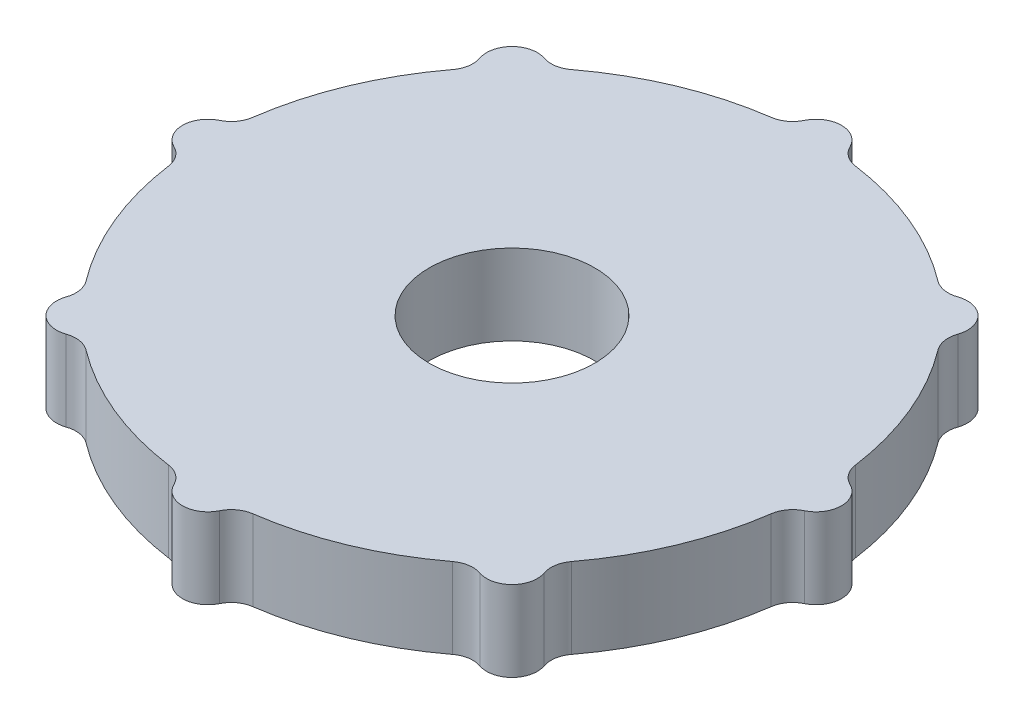
ISO-10303-21;
HEADER;
FILE_DESCRIPTION(('STEP AP214'),'2;1');
FILE_NAME('part.step','',(''),(''),'','','');
FILE_SCHEMA(('AUTOMOTIVE_DESIGN { 1 0 10303 214 1 1 1 1 }'));
ENDSEC;
DATA;
#1=APPLICATION_CONTEXT('core data for automotive mechanical design processes');
#2=APPLICATION_PROTOCOL_DEFINITION('international standard','automotive_design',2000,#1);
#3=PRODUCT_CONTEXT('',#1,'mechanical');
#4=PRODUCT('Part','Part','',(#3));
#5=PRODUCT_RELATED_PRODUCT_CATEGORY('part','',(#4));
#6=PRODUCT_DEFINITION_FORMATION('','',#4);
#7=PRODUCT_DEFINITION_CONTEXT('part definition',#1,'design');
#8=PRODUCT_DEFINITION('design','',#6,#7);
#9=PRODUCT_DEFINITION_SHAPE('','',#8);
#10=(LENGTH_UNIT() NAMED_UNIT(*) SI_UNIT(.MILLI.,.METRE.));
#11=(NAMED_UNIT(*) PLANE_ANGLE_UNIT() SI_UNIT($,.RADIAN.));
#12=(NAMED_UNIT(*) SI_UNIT($,.STERADIAN.) SOLID_ANGLE_UNIT());
#13=UNCERTAINTY_MEASURE_WITH_UNIT(LENGTH_MEASURE(1.E-05),#10,'distance_accuracy_value','');
#14=(GEOMETRIC_REPRESENTATION_CONTEXT(3) GLOBAL_UNCERTAINTY_ASSIGNED_CONTEXT((#13)) GLOBAL_UNIT_ASSIGNED_CONTEXT((#10,
#11,#12)) REPRESENTATION_CONTEXT('',''));
#15=CARTESIAN_POINT('',(0.,0.,0.));
#16=DIRECTION('',(0.,0.,1.));
#17=DIRECTION('',(1.,0.,0.));
#18=AXIS2_PLACEMENT_3D('',#15,#16,#17);
#19=CARTESIAN_POINT('',(0.,3.175,0.));
#20=DIRECTION('',(0.,-1.,0.));
#21=DIRECTION('',(0.,0.,-1.));
#22=AXIS2_PLACEMENT_3D('',#19,#20,#21);
#23=CYLINDRICAL_SURFACE('',#22,12.);
#24=DIRECTION('',(0.,-1.,0.));
#25=VECTOR('',#24,1.);
#26=CARTESIAN_POINT('',(-11.8846153846154,3.175,-1.66009552730061));
#27=LINE('',#26,#25);
#28=CARTESIAN_POINT('',(-11.8846153846154,3.175,-1.66009552730061));
#29=VERTEX_POINT('',#28);
#30=CARTESIAN_POINT('',(-11.8846153846154,0.,-1.66009552730061));
#31=VERTEX_POINT('',#30);
#32=EDGE_CURVE('E324',#29,#31,#27,.T.);
#33=ORIENTED_EDGE('',*,*,#32,.F.);
#34=CARTESIAN_POINT('',(0.,3.175,0.));
#35=DIRECTION('',(0.,1.,0.));
#36=DIRECTION('',(0.,0.,1.));
#37=AXIS2_PLACEMENT_3D('',#34,#35,#36);
#38=CIRCLE('',#37,12.);
#39=CARTESIAN_POINT('',(-9.57755693502715,3.175,-7.22982732548388));
#40=VERTEX_POINT('',#39);
#41=EDGE_CURVE('E528',#40,#29,#38,.T.);
#42=ORIENTED_EDGE('',*,*,#41,.F.);
#43=DIRECTION('',(0.,-1.,0.));
#44=VECTOR('',#43,1.);
#45=CARTESIAN_POINT('',(-9.57755693502715,3.175,-7.22982732548388));
#46=LINE('',#45,#44);
#47=CARTESIAN_POINT('',(-9.57755693502715,0.,-7.22982732548388));
#48=VERTEX_POINT('',#47);
#49=EDGE_CURVE('E357',#40,#48,#46,.T.);
#50=ORIENTED_EDGE('',*,*,#49,.T.);
#51=CARTESIAN_POINT('',(0.,0.,0.));
#52=DIRECTION('',(0.,1.,0.));
#53=DIRECTION('',(0.,0.,1.));
#54=AXIS2_PLACEMENT_3D('',#51,#52,#53);
#55=CIRCLE('',#54,12.);
#56=EDGE_CURVE('E474',#48,#31,#55,.T.);
#57=ORIENTED_EDGE('',*,*,#56,.T.);
#58=EDGE_LOOP('',(#33,#42,#50,#57));
#59=FACE_BOUND('',#58,.T.);
#60=ADVANCED_FACE('F41',(#59),#23,.T.);
#61=DIRECTION('',(0.,-1.,0.));
#62=VECTOR('',#61,1.);
#63=CARTESIAN_POINT('',(-7.22982732548377,3.175,-9.57755693502723));
#64=LINE('',#63,#62);
#65=CARTESIAN_POINT('',(-7.22982732548377,3.175,-9.57755693502723));
#66=VERTEX_POINT('',#65);
#67=CARTESIAN_POINT('',(-7.22982732548377,0.,-9.57755693502723));
#68=VERTEX_POINT('',#67);
#69=EDGE_CURVE('E348',#66,#68,#64,.T.);
#70=ORIENTED_EDGE('',*,*,#69,.F.);
#71=CARTESIAN_POINT('',(-1.66009552730056,3.175,-11.8846153846154));
#72=VERTEX_POINT('',#71);
#73=EDGE_CURVE('E524',#72,#66,#38,.T.);
#74=ORIENTED_EDGE('',*,*,#73,.F.);
#75=DIRECTION('',(0.,-1.,0.));
#76=VECTOR('',#75,1.);
#77=CARTESIAN_POINT('',(-1.66009552730056,3.175,-11.8846153846154));
#78=LINE('',#77,#76);
#79=CARTESIAN_POINT('',(-1.66009552730056,0.,-11.8846153846154));
#80=VERTEX_POINT('',#79);
#81=EDGE_CURVE('E383',#72,#80,#78,.T.);
#82=ORIENTED_EDGE('',*,*,#81,.T.);
#83=EDGE_CURVE('E477',#80,#68,#55,.T.);
#84=ORIENTED_EDGE('',*,*,#83,.T.);
#85=EDGE_LOOP('',(#70,#74,#82,#84));
#86=FACE_BOUND('',#85,.T.);
#87=ADVANCED_FACE('F553',(#86),#23,.T.);
#88=DIRECTION('',(0.,-1.,0.));
#89=VECTOR('',#88,1.);
#90=CARTESIAN_POINT('',(1.66009552730056,3.175,-11.8846153846154));
#91=LINE('',#90,#89);
#92=CARTESIAN_POINT('',(1.66009552730056,3.175,-11.8846153846154));
#93=VERTEX_POINT('',#92);
#94=CARTESIAN_POINT('',(1.66009552730056,0.,-11.8846153846154));
#95=VERTEX_POINT('',#94);
#96=EDGE_CURVE('E372',#93,#95,#91,.T.);
#97=ORIENTED_EDGE('',*,*,#96,.F.);
#98=CARTESIAN_POINT('',(7.22982732548391,3.175,-9.57755693502712));
#99=VERTEX_POINT('',#98);
#100=EDGE_CURVE('E525',#99,#93,#38,.T.);
#101=ORIENTED_EDGE('',*,*,#100,.F.);
#102=DIRECTION('',(0.,-1.,0.));
#103=VECTOR('',#102,1.);
#104=CARTESIAN_POINT('',(7.22982732548391,3.175,-9.57755693502712));
#105=LINE('',#104,#103);
#106=CARTESIAN_POINT('',(7.22982732548391,0.,-9.57755693502713));
#107=VERTEX_POINT('',#106);
#108=EDGE_CURVE('E408',#99,#107,#105,.T.);
#109=ORIENTED_EDGE('',*,*,#108,.T.);
#110=EDGE_CURVE('E484',#107,#95,#55,.T.);
#111=ORIENTED_EDGE('',*,*,#110,.T.);
#112=EDGE_LOOP('',(#97,#101,#109,#111));
#113=FACE_BOUND('',#112,.T.);
#114=ADVANCED_FACE('F556',(#113),#23,.T.);
#115=DIRECTION('',(0.,-1.,0.));
#116=VECTOR('',#115,1.);
#117=CARTESIAN_POINT('',(9.57755693502726,3.175,-7.22982732548374));
#118=LINE('',#117,#116);
#119=CARTESIAN_POINT('',(9.57755693502726,3.175,-7.22982732548374));
#120=VERTEX_POINT('',#119);
#121=CARTESIAN_POINT('',(9.57755693502726,0.,-7.22982732548374));
#122=VERTEX_POINT('',#121);
#123=EDGE_CURVE('E396',#120,#122,#118,.T.);
#124=ORIENTED_EDGE('',*,*,#123,.F.);
#125=CARTESIAN_POINT('',(11.8846153846154,3.175,-1.66009552730043));
#126=VERTEX_POINT('',#125);
#127=EDGE_CURVE('E515',#126,#120,#38,.T.);
#128=ORIENTED_EDGE('',*,*,#127,.F.);
#129=DIRECTION('',(0.,-1.,0.));
#130=VECTOR('',#129,1.);
#131=CARTESIAN_POINT('',(11.8846153846154,3.175,-1.66009552730043));
#132=LINE('',#131,#130);
#133=CARTESIAN_POINT('',(11.8846153846154,0.,-1.66009552730043));
#134=VERTEX_POINT('',#133);
#135=EDGE_CURVE('E292',#126,#134,#132,.T.);
#136=ORIENTED_EDGE('',*,*,#135,.T.);
#137=EDGE_CURVE('E469',#134,#122,#55,.T.);
#138=ORIENTED_EDGE('',*,*,#137,.T.);
#139=EDGE_LOOP('',(#124,#128,#136,#138));
#140=FACE_BOUND('',#139,.T.);
#141=ADVANCED_FACE('F500',(#140),#23,.T.);
#142=DIRECTION('',(0.,-1.,0.));
#143=VECTOR('',#142,1.);
#144=CARTESIAN_POINT('',(11.8846153846154,3.175,1.66009552730069));
#145=LINE('',#144,#143);
#146=CARTESIAN_POINT('',(11.8846153846154,3.175,1.66009552730069));
#147=VERTEX_POINT('',#146);
#148=CARTESIAN_POINT('',(11.8846153846154,0.,1.66009552730069));
#149=VERTEX_POINT('',#148);
#150=EDGE_CURVE('E284',#147,#149,#145,.T.);
#151=ORIENTED_EDGE('',*,*,#150,.F.);
#152=CARTESIAN_POINT('',(9.5775569350271,3.175,7.22982732548394));
#153=VERTEX_POINT('',#152);
#154=EDGE_CURVE('E274',#153,#147,#38,.T.);
#155=ORIENTED_EDGE('',*,*,#154,.F.);
#156=DIRECTION('',(0.,-1.,0.));
#157=VECTOR('',#156,1.);
#158=CARTESIAN_POINT('',(9.5775569350271,3.175,7.22982732548394));
#159=LINE('',#158,#157);
#160=CARTESIAN_POINT('',(9.5775569350271,0.,7.22982732548394));
#161=VERTEX_POINT('',#160);
#162=EDGE_CURVE('E315',#153,#161,#159,.T.);
#163=ORIENTED_EDGE('',*,*,#162,.T.);
#164=EDGE_CURVE('E462',#161,#149,#55,.T.);
#165=ORIENTED_EDGE('',*,*,#164,.T.);
#166=EDGE_LOOP('',(#151,#155,#163,#165));
#167=FACE_BOUND('',#166,.T.);
#168=ADVANCED_FACE('F605',(#167),#23,.T.);
#169=DIRECTION('',(0.,-1.,0.));
#170=VECTOR('',#169,1.);
#171=CARTESIAN_POINT('',(7.2298273254837,3.175,9.57755693502728));
#172=LINE('',#171,#170);
#173=CARTESIAN_POINT('',(7.2298273254837,3.175,9.57755693502728));
#174=VERTEX_POINT('',#173);
#175=CARTESIAN_POINT('',(7.2298273254837,0.,9.57755693502728));
#176=VERTEX_POINT('',#175);
#177=EDGE_CURVE('E301',#174,#176,#172,.T.);
#178=ORIENTED_EDGE('',*,*,#177,.F.);
#179=CARTESIAN_POINT('',(1.66009552730056,3.175,11.8846153846154));
#180=VERTEX_POINT('',#179);
#181=EDGE_CURVE('E49',#180,#174,#38,.T.);
#182=ORIENTED_EDGE('',*,*,#181,.F.);
#183=DIRECTION('',(0.,-1.,0.));
#184=VECTOR('',#183,1.);
#185=CARTESIAN_POINT('',(1.66009552730056,3.175,11.8846153846154));
#186=LINE('',#185,#184);
#187=CARTESIAN_POINT('',(1.66009552730056,0.,11.8846153846154));
#188=VERTEX_POINT('',#187);
#189=EDGE_CURVE('E455',#180,#188,#186,.T.);
#190=ORIENTED_EDGE('',*,*,#189,.T.);
#191=EDGE_CURVE('E463',#188,#176,#55,.T.);
#192=ORIENTED_EDGE('',*,*,#191,.T.);
#193=EDGE_LOOP('',(#178,#182,#190,#192));
#194=FACE_BOUND('',#193,.T.);
#195=ADVANCED_FACE('F554',(#194),#23,.T.);
#196=CARTESIAN_POINT('',(-11.8846153846154,3.175,1.66009552730051));
#197=VERTEX_POINT('',#196);
#198=CARTESIAN_POINT('',(-9.57755693502721,3.175,7.2298273254838));
#199=VERTEX_POINT('',#198);
#200=EDGE_CURVE('E529',#197,#199,#38,.T.);
#201=ORIENTED_EDGE('',*,*,#200,.F.);
#202=DIRECTION('',(0.,-1.,0.));
#203=VECTOR('',#202,1.);
#204=CARTESIAN_POINT('',(-11.8846153846154,3.175,1.66009552730051));
#205=LINE('',#204,#203);
#206=CARTESIAN_POINT('',(-11.8846153846154,0.,1.66009552730051));
#207=VERTEX_POINT('',#206);
#208=EDGE_CURVE('E333',#197,#207,#205,.T.);
#209=ORIENTED_EDGE('',*,*,#208,.T.);
#210=CARTESIAN_POINT('',(-9.57755693502721,0.,7.2298273254838));
#211=VERTEX_POINT('',#210);
#212=EDGE_CURVE('E467',#207,#211,#55,.T.);
#213=ORIENTED_EDGE('',*,*,#212,.T.);
#214=DIRECTION('',(0.,-1.,0.));
#215=VECTOR('',#214,1.);
#216=CARTESIAN_POINT('',(-9.57755693502721,3.175,7.2298273254838));
#217=LINE('',#216,#215);
#218=EDGE_CURVE('E420',#199,#211,#217,.T.);
#219=ORIENTED_EDGE('',*,*,#218,.F.);
#220=EDGE_LOOP('',(#201,#209,#213,#219));
#221=FACE_BOUND('',#220,.T.);
#222=ADVANCED_FACE('F546',(#221),#23,.T.);
#223=CARTESIAN_POINT('',(-7.22982732548384,3.175,9.57755693502718));
#224=VERTEX_POINT('',#223);
#225=CARTESIAN_POINT('',(-1.66009552730056,3.175,11.8846153846154));
#226=VERTEX_POINT('',#225);
#227=EDGE_CURVE('E458',#224,#226,#38,.T.);
#228=ORIENTED_EDGE('',*,*,#227,.F.);
#229=DIRECTION('',(0.,-1.,0.));
#230=VECTOR('',#229,1.);
#231=CARTESIAN_POINT('',(-7.22982732548384,3.175,9.57755693502718));
#232=LINE('',#231,#230);
#233=CARTESIAN_POINT('',(-7.22982732548384,0.,9.57755693502718));
#234=VERTEX_POINT('',#233);
#235=EDGE_CURVE('E430',#224,#234,#232,.T.);
#236=ORIENTED_EDGE('',*,*,#235,.T.);
#237=CARTESIAN_POINT('',(-1.66009552730056,0.,11.8846153846154));
#238=VERTEX_POINT('',#237);
#239=EDGE_CURVE('E459',#234,#238,#55,.T.);
#240=ORIENTED_EDGE('',*,*,#239,.T.);
#241=DIRECTION('',(0.,-1.,0.));
#242=VECTOR('',#241,1.);
#243=CARTESIAN_POINT('',(-1.66009552730056,3.175,11.8846153846154));
#244=LINE('',#243,#242);
#245=EDGE_CURVE('E444',#226,#238,#244,.T.);
#246=ORIENTED_EDGE('',*,*,#245,.F.);
#247=EDGE_LOOP('',(#228,#236,#240,#246));
#248=FACE_BOUND('',#247,.T.);
#249=ADVANCED_FACE('F43',(#248),#23,.T.);
#250=CARTESIAN_POINT('',(0.,3.175,0.));
#251=DIRECTION('',(0.,-1.,0.));
#252=DIRECTION('',(0.,0.,-1.));
#253=AXIS2_PLACEMENT_3D('',#250,#251,#252);
#254=CYLINDRICAL_SURFACE('',#253,3.2639);
#255=CARTESIAN_POINT('',(0.,3.175,0.));
#256=DIRECTION('',(0.,1.,0.));
#257=DIRECTION('',(0.,0.,1.));
#258=AXIS2_PLACEMENT_3D('',#255,#256,#257);
#259=CIRCLE('',#258,3.2639);
#260=CARTESIAN_POINT('',(0.,3.175,3.2639));
#261=VERTEX_POINT('',#260);
#262=EDGE_CURVE('E11',#261,#261,#259,.T.);
#263=ORIENTED_EDGE('',*,*,#262,.T.);
#264=EDGE_LOOP('',(#263));
#265=FACE_BOUND('',#264,.T.);
#266=CARTESIAN_POINT('',(0.,0.,0.));
#267=DIRECTION('',(0.,1.,0.));
#268=DIRECTION('',(0.,0.,1.));
#269=AXIS2_PLACEMENT_3D('',#266,#267,#268);
#270=CIRCLE('',#269,3.2639);
#271=CARTESIAN_POINT('',(0.,0.,3.2639));
#272=VERTEX_POINT('',#271);
#273=EDGE_CURVE('E44',#272,#272,#270,.T.);
#274=ORIENTED_EDGE('',*,*,#273,.F.);
#275=EDGE_LOOP('',(#274));
#276=FACE_BOUND('',#275,.T.);
#277=ADVANCED_FACE('F544',(#265,#276),#254,.F.);
#278=CARTESIAN_POINT('',(0.,3.175,0.));
#279=DIRECTION('',(0.,1.,0.));
#280=DIRECTION('',(0.,0.,1.));
#281=AXIS2_PLACEMENT_3D('',#278,#279,#280);
#282=PLANE('',#281);
#283=ORIENTED_EDGE('',*,*,#181,.T.);
#284=CARTESIAN_POINT('',(7.83231293594069,3.175,10.3756866796129));
#285=DIRECTION('',(0.,1.,0.));
#286=DIRECTION('',(0.707106781186539,0.,0.707106781186556));
#287=AXIS2_PLACEMENT_3D('',#284,#285,#286);
#288=CIRCLE('',#287,1.00000000000001);
#289=CARTESIAN_POINT('',(8.15879715508958,3.175,9.43048402692578));
#290=VERTEX_POINT('',#289);
#291=EDGE_CURVE('E293',#290,#174,#288,.T.);
#292=ORIENTED_EDGE('',*,*,#291,.F.);
#293=CARTESIAN_POINT('',(8.48528137423847,3.175,8.48528137423867));
#294=DIRECTION('',(0.,1.,0.));
#295=DIRECTION('',(0.707106781186539,0.,0.707106781186556));
#296=AXIS2_PLACEMENT_3D('',#293,#294,#295);
#297=CIRCLE('',#296,1.);
#298=CARTESIAN_POINT('',(9.43048402692558,3.175,8.15879715508981));
#299=VERTEX_POINT('',#298);
#300=EDGE_CURVE('E299',#299,#290,#297,.F.);
#301=ORIENTED_EDGE('',*,*,#300,.F.);
#302=CARTESIAN_POINT('',(10.3756866796127,3.175,7.83231293594094));
#303=DIRECTION('',(0.,1.,0.));
#304=DIRECTION('',(0.707106781186539,0.,0.707106781186556));
#305=AXIS2_PLACEMENT_3D('',#302,#303,#304);
#306=CIRCLE('',#305,1.);
#307=EDGE_CURVE('E303',#299,#153,#306,.F.);
#308=ORIENTED_EDGE('',*,*,#307,.T.);
#309=ORIENTED_EDGE('',*,*,#154,.T.);
#310=CARTESIAN_POINT('',(12.875,3.175,1.79843682124241));
#311=DIRECTION('',(0.,1.,0.));
#312=DIRECTION('',(1.,0.,0.));
#313=AXIS2_PLACEMENT_3D('',#310,#311,#312);
#314=CIRCLE('',#313,1.00000000000001);
#315=CARTESIAN_POINT('',(12.4375,3.175,0.899218410621265));
#316=VERTEX_POINT('',#315);
#317=EDGE_CURVE('E258',#316,#147,#314,.T.);
#318=ORIENTED_EDGE('',*,*,#317,.F.);
#319=CARTESIAN_POINT('',(12.,3.175,1.25656588794378E-13));
#320=DIRECTION('',(0.,1.,0.));
#321=DIRECTION('',(1.,0.,0.));
#322=AXIS2_PLACEMENT_3D('',#319,#320,#321);
#323=CIRCLE('',#322,1.);
#324=CARTESIAN_POINT('',(12.4375,3.175,-0.899218410621004));
#325=VERTEX_POINT('',#324);
#326=EDGE_CURVE('E272',#325,#316,#323,.F.);
#327=ORIENTED_EDGE('',*,*,#326,.F.);
#328=CARTESIAN_POINT('',(12.875,3.175,-1.79843682124213));
#329=DIRECTION('',(0.,1.,0.));
#330=DIRECTION('',(1.,0.,0.));
#331=AXIS2_PLACEMENT_3D('',#328,#329,#330);
#332=CIRCLE('',#331,1.);
#333=EDGE_CURVE('E278',#325,#126,#332,.F.);
#334=ORIENTED_EDGE('',*,*,#333,.T.);
#335=ORIENTED_EDGE('',*,*,#127,.T.);
#336=CARTESIAN_POINT('',(10.3756866796129,3.175,-7.83231293594072));
#337=DIRECTION('',(0.,1.,0.));
#338=DIRECTION('',(0.707106781186554,0.,-0.707106781186541));
#339=AXIS2_PLACEMENT_3D('',#336,#337,#338);
#340=CIRCLE('',#339,1.00000000000001);
#341=CARTESIAN_POINT('',(9.43048402692575,3.175,-8.15879715508961));
#342=VERTEX_POINT('',#341);
#343=EDGE_CURVE('E388',#342,#120,#340,.T.);
#344=ORIENTED_EDGE('',*,*,#343,.F.);
#345=CARTESIAN_POINT('',(8.48528137423864,3.175,-8.4852813742385));
#346=DIRECTION('',(0.,1.,0.));
#347=DIRECTION('',(0.707106781186554,0.,-0.707106781186541));
#348=AXIS2_PLACEMENT_3D('',#345,#346,#347);
#349=CIRCLE('',#348,1.);
#350=CARTESIAN_POINT('',(8.15879715508978,3.175,-9.43048402692561));
#351=VERTEX_POINT('',#350);
#352=EDGE_CURVE('E394',#351,#342,#349,.F.);
#353=ORIENTED_EDGE('',*,*,#352,.F.);
#354=CARTESIAN_POINT('',(7.83231293594091,3.175,-10.3756866796127));
#355=DIRECTION('',(0.,1.,0.));
#356=DIRECTION('',(0.707106781186554,0.,-0.707106781186541));
#357=AXIS2_PLACEMENT_3D('',#354,#355,#356);
#358=CIRCLE('',#357,1.);
#359=EDGE_CURVE('E398',#351,#99,#358,.F.);
#360=ORIENTED_EDGE('',*,*,#359,.T.);
#361=ORIENTED_EDGE('',*,*,#100,.T.);
#362=CARTESIAN_POINT('',(1.79843682124228,3.175,-12.875));
#363=DIRECTION('',(0.,1.,0.));
#364=DIRECTION('',(0.,0.,-1.));
#365=AXIS2_PLACEMENT_3D('',#362,#363,#364);
#366=CIRCLE('',#365,1.00000000000001);
#367=CARTESIAN_POINT('',(0.899218410621135,3.175,-12.4375));
#368=VERTEX_POINT('',#367);
#369=EDGE_CURVE('E368',#368,#93,#366,.T.);
#370=ORIENTED_EDGE('',*,*,#369,.F.);
#371=CARTESIAN_POINT('',(0.,3.175,-12.));
#372=DIRECTION('',(0.,1.,0.));
#373=DIRECTION('',(0.,0.,-1.));
#374=AXIS2_PLACEMENT_3D('',#371,#372,#373);
#375=CIRCLE('',#374,1.);
#376=CARTESIAN_POINT('',(-0.899218410621135,3.175,-12.4375));
#377=VERTEX_POINT('',#376);
#378=EDGE_CURVE('E366',#377,#368,#375,.F.);
#379=ORIENTED_EDGE('',*,*,#378,.F.);
#380=CARTESIAN_POINT('',(-1.79843682124227,3.175,-12.875));
#381=DIRECTION('',(0.,1.,0.));
#382=DIRECTION('',(0.,0.,-1.));
#383=AXIS2_PLACEMENT_3D('',#380,#381,#382);
#384=CIRCLE('',#383,1.);
#385=EDGE_CURVE('E375',#377,#72,#384,.F.);
#386=ORIENTED_EDGE('',*,*,#385,.T.);
#387=ORIENTED_EDGE('',*,*,#73,.T.);
#388=CARTESIAN_POINT('',(-7.83231293594076,3.175,-10.3756866796128));
#389=DIRECTION('',(0.,1.,0.));
#390=DIRECTION('',(-0.707106781186544,0.,-0.707106781186551));
#391=AXIS2_PLACEMENT_3D('',#388,#389,#390);
#392=CIRCLE('',#391,1.00000000000001);
#393=CARTESIAN_POINT('',(-8.15879715508964,3.175,-9.43048402692572));
#394=VERTEX_POINT('',#393);
#395=EDGE_CURVE('E345',#394,#66,#392,.T.);
#396=ORIENTED_EDGE('',*,*,#395,.F.);
#397=CARTESIAN_POINT('',(-8.48528137423853,3.175,-8.48528137423861));
#398=DIRECTION('',(0.,1.,0.));
#399=DIRECTION('',(-0.707106781186544,0.,-0.707106781186551));
#400=AXIS2_PLACEMENT_3D('',#397,#398,#399);
#401=CIRCLE('',#400,1.);
#402=CARTESIAN_POINT('',(-9.43048402692564,3.175,-8.15879715508974));
#403=VERTEX_POINT('',#402);
#404=EDGE_CURVE('E344',#403,#394,#401,.F.);
#405=ORIENTED_EDGE('',*,*,#404,.F.);
#406=CARTESIAN_POINT('',(-10.3756866796128,3.175,-7.83231293594087));
#407=DIRECTION('',(0.,1.,0.));
#408=DIRECTION('',(-0.707106781186544,0.,-0.707106781186551));
#409=AXIS2_PLACEMENT_3D('',#406,#407,#408);
#410=CIRCLE('',#409,1.);
#411=EDGE_CURVE('E346',#403,#40,#410,.F.);
#412=ORIENTED_EDGE('',*,*,#411,.T.);
#413=ORIENTED_EDGE('',*,*,#41,.T.);
#414=CARTESIAN_POINT('',(-12.875,3.175,-1.79843682124232));
#415=DIRECTION('',(0.,1.,0.));
#416=DIRECTION('',(-1.,0.,0.));
#417=AXIS2_PLACEMENT_3D('',#414,#415,#416);
#418=CIRCLE('',#417,1.00000000000001);
#419=CARTESIAN_POINT('',(-12.4375,3.175,-0.899218410621178));
#420=VERTEX_POINT('',#419);
#421=EDGE_CURVE('E318',#420,#29,#418,.T.);
#422=ORIENTED_EDGE('',*,*,#421,.F.);
#423=CARTESIAN_POINT('',(-12.,3.175,0.));
#424=DIRECTION('',(0.,1.,0.));
#425=DIRECTION('',(-1.,0.,0.));
#426=AXIS2_PLACEMENT_3D('',#423,#424,#425);
#427=CIRCLE('',#426,1.);
#428=CARTESIAN_POINT('',(-12.4375,3.175,0.899218410621091));
#429=VERTEX_POINT('',#428);
#430=EDGE_CURVE('E319',#429,#420,#427,.F.);
#431=ORIENTED_EDGE('',*,*,#430,.F.);
#432=CARTESIAN_POINT('',(-12.875,3.175,1.79843682124222));
#433=DIRECTION('',(0.,1.,0.));
#434=DIRECTION('',(-1.,0.,0.));
#435=AXIS2_PLACEMENT_3D('',#432,#433,#434);
#436=CIRCLE('',#435,1.);
#437=EDGE_CURVE('E323',#429,#197,#436,.F.);
#438=ORIENTED_EDGE('',*,*,#437,.T.);
#439=ORIENTED_EDGE('',*,*,#200,.T.);
#440=CARTESIAN_POINT('',(-10.3756866796128,3.175,7.8323129359408));
#441=DIRECTION('',(0.,1.,0.));
#442=DIRECTION('',(-0.707106781186549,0.,0.707106781186546));
#443=AXIS2_PLACEMENT_3D('',#440,#441,#442);
#444=CIRCLE('',#443,1.00000000000001);
#445=CARTESIAN_POINT('',(-9.4304840269257,3.175,8.15879715508968));
#446=VERTEX_POINT('',#445);
#447=EDGE_CURVE('E415',#446,#199,#444,.T.);
#448=ORIENTED_EDGE('',*,*,#447,.F.);
#449=CARTESIAN_POINT('',(-8.48528137423859,3.175,8.48528137423856));
#450=DIRECTION('',(0.,1.,0.));
#451=DIRECTION('',(-0.707106781186549,0.,0.707106781186546));
#452=AXIS2_PLACEMENT_3D('',#449,#450,#451);
#453=CIRCLE('',#452,1.);
#454=CARTESIAN_POINT('',(-8.15879715508971,3.175,9.43048402692567));
#455=VERTEX_POINT('',#454);
#456=EDGE_CURVE('E414',#455,#446,#453,.F.);
#457=ORIENTED_EDGE('',*,*,#456,.F.);
#458=CARTESIAN_POINT('',(-7.83231293594083,3.175,10.3756866796128));
#459=DIRECTION('',(0.,1.,0.));
#460=DIRECTION('',(-0.707106781186549,0.,0.707106781186546));
#461=AXIS2_PLACEMENT_3D('',#458,#459,#460);
#462=CIRCLE('',#461,1.);
#463=EDGE_CURVE('E417',#455,#224,#462,.F.);
#464=ORIENTED_EDGE('',*,*,#463,.T.);
#465=ORIENTED_EDGE('',*,*,#227,.T.);
#466=CARTESIAN_POINT('',(-1.79843682124228,3.175,12.875));
#467=DIRECTION('',(0.,1.,0.));
#468=DIRECTION('',(0.,0.,1.));
#469=AXIS2_PLACEMENT_3D('',#466,#467,#468);
#470=CIRCLE('',#469,1.00000000000001);
#471=CARTESIAN_POINT('',(-0.899218410621135,3.175,12.4375));
#472=VERTEX_POINT('',#471);
#473=EDGE_CURVE('E432',#472,#226,#470,.T.);
#474=ORIENTED_EDGE('',*,*,#473,.F.);
#475=CARTESIAN_POINT('',(0.,3.175,12.));
#476=DIRECTION('',(0.,1.,0.));
#477=DIRECTION('',(0.,0.,1.));
#478=AXIS2_PLACEMENT_3D('',#475,#476,#477);
#479=CIRCLE('',#478,1.);
#480=CARTESIAN_POINT('',(0.899218410621135,3.175,12.4375));
#481=VERTEX_POINT('',#480);
#482=EDGE_CURVE('E440',#481,#472,#479,.F.);
#483=ORIENTED_EDGE('',*,*,#482,.F.);
#484=CARTESIAN_POINT('',(1.79843682124227,3.175,12.875));
#485=DIRECTION('',(0.,1.,0.));
#486=DIRECTION('',(0.,0.,1.));
#487=AXIS2_PLACEMENT_3D('',#484,#485,#486);
#488=CIRCLE('',#487,1.);
#489=EDGE_CURVE('E442',#481,#180,#488,.F.);
#490=ORIENTED_EDGE('',*,*,#489,.T.);
#491=EDGE_LOOP('',(#283,#292,#301,#308,#309,#318,#327,#334,#335,#344,#353,#360,#361,#370,#379,
#386,#387,#396,#405,#412,#413,#422,#431,#438,#439,#448,#457,#464,#465,#474,#483,#490));
#492=FACE_BOUND('',#491,.T.);
#493=ORIENTED_EDGE('',*,*,#262,.F.);
#494=EDGE_LOOP('',(#493));
#495=FACE_BOUND('',#494,.T.);
#496=ADVANCED_FACE('F271',(#492,#495),#282,.T.);
#497=CARTESIAN_POINT('',(0.,0.,0.));
#498=DIRECTION('',(0.,1.,0.));
#499=DIRECTION('',(0.,0.,1.));
#500=AXIS2_PLACEMENT_3D('',#497,#498,#499);
#501=PLANE('',#500);
#502=ORIENTED_EDGE('',*,*,#191,.F.);
#503=CARTESIAN_POINT('',(1.79843682124227,0.,12.875));
#504=DIRECTION('',(0.,1.,0.));
#505=DIRECTION('',(0.,0.,1.));
#506=AXIS2_PLACEMENT_3D('',#503,#504,#505);
#507=CIRCLE('',#506,1.);
#508=CARTESIAN_POINT('',(0.899218410621135,0.,12.4375));
#509=VERTEX_POINT('',#508);
#510=EDGE_CURVE('E437',#509,#188,#507,.F.);
#511=ORIENTED_EDGE('',*,*,#510,.F.);
#512=CARTESIAN_POINT('',(0.,0.,12.));
#513=DIRECTION('',(0.,1.,0.));
#514=DIRECTION('',(0.,0.,1.));
#515=AXIS2_PLACEMENT_3D('',#512,#513,#514);
#516=CIRCLE('',#515,1.);
#517=CARTESIAN_POINT('',(-0.899218410621135,0.,12.4375));
#518=VERTEX_POINT('',#517);
#519=EDGE_CURVE('E448',#509,#518,#516,.F.);
#520=ORIENTED_EDGE('',*,*,#519,.T.);
#521=CARTESIAN_POINT('',(-1.79843682124228,0.,12.875));
#522=DIRECTION('',(0.,1.,0.));
#523=DIRECTION('',(0.,0.,1.));
#524=AXIS2_PLACEMENT_3D('',#521,#522,#523);
#525=CIRCLE('',#524,1.00000000000001);
#526=EDGE_CURVE('E433',#518,#238,#525,.T.);
#527=ORIENTED_EDGE('',*,*,#526,.T.);
#528=ORIENTED_EDGE('',*,*,#239,.F.);
#529=CARTESIAN_POINT('',(-7.83231293594083,0.,10.3756866796128));
#530=DIRECTION('',(0.,1.,0.));
#531=DIRECTION('',(-0.707106781186549,0.,0.707106781186546));
#532=AXIS2_PLACEMENT_3D('',#529,#530,#531);
#533=CIRCLE('',#532,1.);
#534=CARTESIAN_POINT('',(-8.15879715508971,0.,9.43048402692567));
#535=VERTEX_POINT('',#534);
#536=EDGE_CURVE('E59',#535,#234,#533,.F.);
#537=ORIENTED_EDGE('',*,*,#536,.F.);
#538=CARTESIAN_POINT('',(-8.48528137423859,0.,8.48528137423856));
#539=DIRECTION('',(0.,1.,0.));
#540=DIRECTION('',(-0.707106781186549,0.,0.707106781186546));
#541=AXIS2_PLACEMENT_3D('',#538,#539,#540);
#542=CIRCLE('',#541,1.);
#543=CARTESIAN_POINT('',(-9.4304840269257,0.,8.15879715508968));
#544=VERTEX_POINT('',#543);
#545=EDGE_CURVE('E425',#535,#544,#542,.F.);
#546=ORIENTED_EDGE('',*,*,#545,.T.);
#547=CARTESIAN_POINT('',(-10.3756866796128,0.,7.8323129359408));
#548=DIRECTION('',(0.,1.,0.));
#549=DIRECTION('',(-0.707106781186549,0.,0.707106781186546));
#550=AXIS2_PLACEMENT_3D('',#547,#548,#549);
#551=CIRCLE('',#550,1.00000000000001);
#552=EDGE_CURVE('E343',#544,#211,#551,.T.);
#553=ORIENTED_EDGE('',*,*,#552,.T.);
#554=ORIENTED_EDGE('',*,*,#212,.F.);
#555=CARTESIAN_POINT('',(-12.875,0.,1.79843682124222));
#556=DIRECTION('',(0.,1.,0.));
#557=DIRECTION('',(-1.,0.,0.));
#558=AXIS2_PLACEMENT_3D('',#555,#556,#557);
#559=CIRCLE('',#558,1.);
#560=CARTESIAN_POINT('',(-12.4375,0.,0.899218410621091));
#561=VERTEX_POINT('',#560);
#562=EDGE_CURVE('E68',#561,#207,#559,.F.);
#563=ORIENTED_EDGE('',*,*,#562,.F.);
#564=CARTESIAN_POINT('',(-12.,0.,0.));
#565=DIRECTION('',(0.,1.,0.));
#566=DIRECTION('',(-1.,0.,0.));
#567=AXIS2_PLACEMENT_3D('',#564,#565,#566);
#568=CIRCLE('',#567,1.);
#569=CARTESIAN_POINT('',(-12.4375,0.,-0.899218410621178));
#570=VERTEX_POINT('',#569);
#571=EDGE_CURVE('E328',#561,#570,#568,.F.);
#572=ORIENTED_EDGE('',*,*,#571,.T.);
#573=CARTESIAN_POINT('',(-12.875,0.,-1.79843682124232));
#574=DIRECTION('',(0.,1.,0.));
#575=DIRECTION('',(-1.,0.,0.));
#576=AXIS2_PLACEMENT_3D('',#573,#574,#575);
#577=CIRCLE('',#576,1.00000000000001);
#578=EDGE_CURVE('E326',#570,#31,#577,.T.);
#579=ORIENTED_EDGE('',*,*,#578,.T.);
#580=ORIENTED_EDGE('',*,*,#56,.F.);
#581=CARTESIAN_POINT('',(-10.3756866796128,0.,-7.83231293594087));
#582=DIRECTION('',(0.,1.,0.));
#583=DIRECTION('',(-0.707106781186544,0.,-0.707106781186551));
#584=AXIS2_PLACEMENT_3D('',#581,#582,#583);
#585=CIRCLE('',#584,1.);
#586=CARTESIAN_POINT('',(-9.43048402692564,0.,-8.15879715508974));
#587=VERTEX_POINT('',#586);
#588=EDGE_CURVE('E342',#587,#48,#585,.F.);
#589=ORIENTED_EDGE('',*,*,#588,.F.);
#590=CARTESIAN_POINT('',(-8.48528137423853,0.,-8.48528137423861));
#591=DIRECTION('',(0.,1.,0.));
#592=DIRECTION('',(-0.707106781186544,0.,-0.707106781186551));
#593=AXIS2_PLACEMENT_3D('',#590,#591,#592);
#594=CIRCLE('',#593,1.);
#595=CARTESIAN_POINT('',(-8.15879715508964,0.,-9.43048402692572));
#596=VERTEX_POINT('',#595);
#597=EDGE_CURVE('E355',#587,#596,#594,.F.);
#598=ORIENTED_EDGE('',*,*,#597,.T.);
#599=CARTESIAN_POINT('',(-7.83231293594076,0.,-10.3756866796128));
#600=DIRECTION('',(0.,1.,0.));
#601=DIRECTION('',(-0.707106781186544,0.,-0.707106781186551));
#602=AXIS2_PLACEMENT_3D('',#599,#600,#601);
#603=CIRCLE('',#602,1.00000000000001);
#604=EDGE_CURVE('E353',#596,#68,#603,.T.);
#605=ORIENTED_EDGE('',*,*,#604,.T.);
#606=ORIENTED_EDGE('',*,*,#83,.F.);
#607=CARTESIAN_POINT('',(-1.79843682124227,0.,-12.875));
#608=DIRECTION('',(0.,1.,0.));
#609=DIRECTION('',(0.,0.,-1.));
#610=AXIS2_PLACEMENT_3D('',#607,#608,#609);
#611=CIRCLE('',#610,1.);
#612=CARTESIAN_POINT('',(-0.899218410621135,0.,-12.4375));
#613=VERTEX_POINT('',#612);
#614=EDGE_CURVE('E369',#613,#80,#611,.F.);
#615=ORIENTED_EDGE('',*,*,#614,.F.);
#616=CARTESIAN_POINT('',(0.,0.,-12.));
#617=DIRECTION('',(0.,1.,0.));
#618=DIRECTION('',(0.,0.,-1.));
#619=AXIS2_PLACEMENT_3D('',#616,#617,#618);
#620=CIRCLE('',#619,1.);
#621=CARTESIAN_POINT('',(0.899218410621135,0.,-12.4375));
#622=VERTEX_POINT('',#621);
#623=EDGE_CURVE('E378',#613,#622,#620,.F.);
#624=ORIENTED_EDGE('',*,*,#623,.T.);
#625=CARTESIAN_POINT('',(1.79843682124228,0.,-12.875));
#626=DIRECTION('',(0.,1.,0.));
#627=DIRECTION('',(0.,0.,-1.));
#628=AXIS2_PLACEMENT_3D('',#625,#626,#627);
#629=CIRCLE('',#628,1.00000000000001);
#630=EDGE_CURVE('E374',#622,#95,#629,.T.);
#631=ORIENTED_EDGE('',*,*,#630,.T.);
#632=ORIENTED_EDGE('',*,*,#110,.F.);
#633=CARTESIAN_POINT('',(7.83231293594091,0.,-10.3756866796127));
#634=DIRECTION('',(0.,1.,0.));
#635=DIRECTION('',(0.707106781186554,0.,-0.707106781186541));
#636=AXIS2_PLACEMENT_3D('',#633,#634,#635);
#637=CIRCLE('',#636,1.);
#638=CARTESIAN_POINT('',(8.15879715508978,0.,-9.43048402692561));
#639=VERTEX_POINT('',#638);
#640=EDGE_CURVE('E392',#639,#107,#637,.F.);
#641=ORIENTED_EDGE('',*,*,#640,.F.);
#642=CARTESIAN_POINT('',(8.48528137423864,0.,-8.4852813742385));
#643=DIRECTION('',(0.,1.,0.));
#644=DIRECTION('',(0.707106781186554,0.,-0.707106781186541));
#645=AXIS2_PLACEMENT_3D('',#642,#643,#644);
#646=CIRCLE('',#645,1.);
#647=CARTESIAN_POINT('',(9.43048402692575,0.,-8.15879715508961));
#648=VERTEX_POINT('',#647);
#649=EDGE_CURVE('E402',#639,#648,#646,.F.);
#650=ORIENTED_EDGE('',*,*,#649,.T.);
#651=CARTESIAN_POINT('',(10.3756866796129,0.,-7.83231293594072));
#652=DIRECTION('',(0.,1.,0.));
#653=DIRECTION('',(0.707106781186554,0.,-0.707106781186541));
#654=AXIS2_PLACEMENT_3D('',#651,#652,#653);
#655=CIRCLE('',#654,1.00000000000001);
#656=EDGE_CURVE('E262',#648,#122,#655,.T.);
#657=ORIENTED_EDGE('',*,*,#656,.T.);
#658=ORIENTED_EDGE('',*,*,#137,.F.);
#659=CARTESIAN_POINT('',(12.875,0.,-1.79843682124213));
#660=DIRECTION('',(0.,1.,0.));
#661=DIRECTION('',(1.,0.,0.));
#662=AXIS2_PLACEMENT_3D('',#659,#660,#661);
#663=CIRCLE('',#662,1.);
#664=CARTESIAN_POINT('',(12.4375,0.,-0.899218410621004));
#665=VERTEX_POINT('',#664);
#666=EDGE_CURVE('E277',#665,#134,#663,.F.);
#667=ORIENTED_EDGE('',*,*,#666,.F.);
#668=CARTESIAN_POINT('',(12.,0.,1.25656588794378E-13));
#669=DIRECTION('',(0.,1.,0.));
#670=DIRECTION('',(1.,0.,0.));
#671=AXIS2_PLACEMENT_3D('',#668,#669,#670);
#672=CIRCLE('',#671,1.);
#673=CARTESIAN_POINT('',(12.4375,0.,0.899218410621265));
#674=VERTEX_POINT('',#673);
#675=EDGE_CURVE('E288',#665,#674,#672,.F.);
#676=ORIENTED_EDGE('',*,*,#675,.T.);
#677=CARTESIAN_POINT('',(12.875,0.,1.79843682124241));
#678=DIRECTION('',(0.,1.,0.));
#679=DIRECTION('',(1.,0.,0.));
#680=AXIS2_PLACEMENT_3D('',#677,#678,#679);
#681=CIRCLE('',#680,1.00000000000001);
#682=EDGE_CURVE('E259',#674,#149,#681,.T.);
#683=ORIENTED_EDGE('',*,*,#682,.T.);
#684=ORIENTED_EDGE('',*,*,#164,.F.);
#685=CARTESIAN_POINT('',(10.3756866796127,0.,7.83231293594094));
#686=DIRECTION('',(0.,1.,0.));
#687=DIRECTION('',(0.707106781186539,0.,0.707106781186556));
#688=AXIS2_PLACEMENT_3D('',#685,#686,#687);
#689=CIRCLE('',#688,1.);
#690=CARTESIAN_POINT('',(9.43048402692558,0.,8.15879715508981));
#691=VERTEX_POINT('',#690);
#692=EDGE_CURVE('E297',#691,#161,#689,.F.);
#693=ORIENTED_EDGE('',*,*,#692,.F.);
#694=CARTESIAN_POINT('',(8.48528137423847,0.,8.48528137423867));
#695=DIRECTION('',(0.,1.,0.));
#696=DIRECTION('',(0.707106781186539,0.,0.707106781186556));
#697=AXIS2_PLACEMENT_3D('',#694,#695,#696);
#698=CIRCLE('',#697,1.);
#699=CARTESIAN_POINT('',(8.15879715508958,0.,9.43048402692578));
#700=VERTEX_POINT('',#699);
#701=EDGE_CURVE('E307',#691,#700,#698,.F.);
#702=ORIENTED_EDGE('',*,*,#701,.T.);
#703=CARTESIAN_POINT('',(7.83231293594069,0.,10.3756866796129));
#704=DIRECTION('',(0.,1.,0.));
#705=DIRECTION('',(0.707106781186539,0.,0.707106781186556));
#706=AXIS2_PLACEMENT_3D('',#703,#704,#705);
#707=CIRCLE('',#706,1.00000000000001);
#708=EDGE_CURVE('E304',#700,#176,#707,.T.);
#709=ORIENTED_EDGE('',*,*,#708,.T.);
#710=EDGE_LOOP('',(#502,#511,#520,#527,#528,#537,#546,#553,#554,#563,#572,#579,#580,#589,#598,
#605,#606,#615,#624,#631,#632,#641,#650,#657,#658,#667,#676,#683,#684,#693,#702,#709));
#711=FACE_BOUND('',#710,.T.);
#712=ORIENTED_EDGE('',*,*,#273,.T.);
#713=EDGE_LOOP('',(#712));
#714=FACE_BOUND('',#713,.T.);
#715=ADVANCED_FACE('F502',(#711,#714),#501,.F.);
#716=CARTESIAN_POINT('',(-1.79843682124228,3.175,12.875));
#717=DIRECTION('',(0.,-1.,0.));
#718=DIRECTION('',(0.,0.,-1.));
#719=AXIS2_PLACEMENT_3D('',#716,#717,#718);
#720=CYLINDRICAL_SURFACE('',#719,1.00000000000001);
#721=ORIENTED_EDGE('',*,*,#526,.F.);
#722=DIRECTION('',(0.,-1.,0.));
#723=VECTOR('',#722,1.);
#724=CARTESIAN_POINT('',(-0.899218410621135,3.175,12.4375));
#725=LINE('',#724,#723);
#726=EDGE_CURVE('E460',#472,#518,#725,.T.);
#727=ORIENTED_EDGE('',*,*,#726,.F.);
#728=ORIENTED_EDGE('',*,*,#473,.T.);
#729=ORIENTED_EDGE('',*,*,#245,.T.);
#730=EDGE_LOOP('',(#721,#727,#728,#729));
#731=FACE_BOUND('',#730,.T.);
#732=ADVANCED_FACE('F543',(#731),#720,.F.);
#733=CARTESIAN_POINT('',(0.,3.175,12.));
#734=DIRECTION('',(0.,-1.,0.));
#735=DIRECTION('',(0.,0.,-1.));
#736=AXIS2_PLACEMENT_3D('',#733,#734,#735);
#737=CYLINDRICAL_SURFACE('',#736,1.);
#738=ORIENTED_EDGE('',*,*,#519,.F.);
#739=DIRECTION('',(0.,-1.,0.));
#740=VECTOR('',#739,1.);
#741=CARTESIAN_POINT('',(0.899218410621135,3.175,12.4375));
#742=LINE('',#741,#740);
#743=EDGE_CURVE('E452',#481,#509,#742,.T.);
#744=ORIENTED_EDGE('',*,*,#743,.F.);
#745=ORIENTED_EDGE('',*,*,#482,.T.);
#746=ORIENTED_EDGE('',*,*,#726,.T.);
#747=EDGE_LOOP('',(#738,#744,#745,#746));
#748=FACE_BOUND('',#747,.T.);
#749=ADVANCED_FACE('F583',(#748),#737,.T.);
#750=CARTESIAN_POINT('',(1.79843682124227,3.175,12.875));
#751=DIRECTION('',(0.,-1.,0.));
#752=DIRECTION('',(0.,0.,-1.));
#753=AXIS2_PLACEMENT_3D('',#750,#751,#752);
#754=CYLINDRICAL_SURFACE('',#753,1.);
#755=ORIENTED_EDGE('',*,*,#510,.T.);
#756=ORIENTED_EDGE('',*,*,#189,.F.);
#757=ORIENTED_EDGE('',*,*,#489,.F.);
#758=ORIENTED_EDGE('',*,*,#743,.T.);
#759=EDGE_LOOP('',(#755,#756,#757,#758));
#760=FACE_BOUND('',#759,.T.);
#761=ADVANCED_FACE('F590',(#760),#754,.F.);
#762=CARTESIAN_POINT('',(-10.3756866796128,3.175,7.8323129359408));
#763=DIRECTION('',(0.,-1.,0.));
#764=DIRECTION('',(0.,0.,-1.));
#765=AXIS2_PLACEMENT_3D('',#762,#763,#764);
#766=CYLINDRICAL_SURFACE('',#765,1.00000000000001);
#767=ORIENTED_EDGE('',*,*,#552,.F.);
#768=DIRECTION('',(0.,-1.,0.));
#769=VECTOR('',#768,1.);
#770=CARTESIAN_POINT('',(-9.4304840269257,3.175,8.15879715508968));
#771=LINE('',#770,#769);
#772=EDGE_CURVE('E431',#446,#544,#771,.T.);
#773=ORIENTED_EDGE('',*,*,#772,.F.);
#774=ORIENTED_EDGE('',*,*,#447,.T.);
#775=ORIENTED_EDGE('',*,*,#218,.T.);
#776=EDGE_LOOP('',(#767,#773,#774,#775));
#777=FACE_BOUND('',#776,.T.);
#778=ADVANCED_FACE('F572',(#777),#766,.F.);
#779=CARTESIAN_POINT('',(-8.48528137423859,3.175,8.48528137423856));
#780=DIRECTION('',(0.,-1.,0.));
#781=DIRECTION('',(0.,0.,-1.));
#782=AXIS2_PLACEMENT_3D('',#779,#780,#781);
#783=CYLINDRICAL_SURFACE('',#782,1.);
#784=ORIENTED_EDGE('',*,*,#545,.F.);
#785=DIRECTION('',(0.,-1.,0.));
#786=VECTOR('',#785,1.);
#787=CARTESIAN_POINT('',(-8.15879715508971,3.175,9.43048402692567));
#788=LINE('',#787,#786);
#789=EDGE_CURVE('E427',#455,#535,#788,.T.);
#790=ORIENTED_EDGE('',*,*,#789,.F.);
#791=ORIENTED_EDGE('',*,*,#456,.T.);
#792=ORIENTED_EDGE('',*,*,#772,.T.);
#793=EDGE_LOOP('',(#784,#790,#791,#792));
#794=FACE_BOUND('',#793,.T.);
#795=ADVANCED_FACE('F578',(#794),#783,.T.);
#796=CARTESIAN_POINT('',(-7.83231293594083,3.175,10.3756866796128));
#797=DIRECTION('',(0.,-1.,0.));
#798=DIRECTION('',(0.,0.,-1.));
#799=AXIS2_PLACEMENT_3D('',#796,#797,#798);
#800=CYLINDRICAL_SURFACE('',#799,1.);
#801=ORIENTED_EDGE('',*,*,#536,.T.);
#802=ORIENTED_EDGE('',*,*,#235,.F.);
#803=ORIENTED_EDGE('',*,*,#463,.F.);
#804=ORIENTED_EDGE('',*,*,#789,.T.);
#805=EDGE_LOOP('',(#801,#802,#803,#804));
#806=FACE_BOUND('',#805,.T.);
#807=ADVANCED_FACE('F580',(#806),#800,.F.);
#808=CARTESIAN_POINT('',(7.83231293594069,3.175,10.3756866796129));
#809=DIRECTION('',(0.,-1.,0.));
#810=DIRECTION('',(0.,0.,-1.));
#811=AXIS2_PLACEMENT_3D('',#808,#809,#810);
#812=CYLINDRICAL_SURFACE('',#811,1.00000000000001);
#813=ORIENTED_EDGE('',*,*,#708,.F.);
#814=DIRECTION('',(0.,-1.,0.));
#815=VECTOR('',#814,1.);
#816=CARTESIAN_POINT('',(8.15879715508958,3.175,9.43048402692578));
#817=LINE('',#816,#815);
#818=EDGE_CURVE('E290',#290,#700,#817,.T.);
#819=ORIENTED_EDGE('',*,*,#818,.F.);
#820=ORIENTED_EDGE('',*,*,#291,.T.);
#821=ORIENTED_EDGE('',*,*,#177,.T.);
#822=EDGE_LOOP('',(#813,#819,#820,#821));
#823=FACE_BOUND('',#822,.T.);
#824=ADVANCED_FACE('F587',(#823),#812,.F.);
#825=CARTESIAN_POINT('',(8.48528137423847,3.175,8.48528137423867));
#826=DIRECTION('',(0.,-1.,0.));
#827=DIRECTION('',(0.,0.,-1.));
#828=AXIS2_PLACEMENT_3D('',#825,#826,#827);
#829=CYLINDRICAL_SURFACE('',#828,1.);
#830=ORIENTED_EDGE('',*,*,#701,.F.);
#831=DIRECTION('',(0.,-1.,0.));
#832=VECTOR('',#831,1.);
#833=CARTESIAN_POINT('',(9.43048402692558,3.175,8.15879715508981));
#834=LINE('',#833,#832);
#835=EDGE_CURVE('E312',#299,#691,#834,.T.);
#836=ORIENTED_EDGE('',*,*,#835,.F.);
#837=ORIENTED_EDGE('',*,*,#300,.T.);
#838=ORIENTED_EDGE('',*,*,#818,.T.);
#839=EDGE_LOOP('',(#830,#836,#837,#838));
#840=FACE_BOUND('',#839,.T.);
#841=ADVANCED_FACE('F594',(#840),#829,.T.);
#842=CARTESIAN_POINT('',(10.3756866796127,3.175,7.83231293594094));
#843=DIRECTION('',(0.,-1.,0.));
#844=DIRECTION('',(0.,0.,-1.));
#845=AXIS2_PLACEMENT_3D('',#842,#843,#844);
#846=CYLINDRICAL_SURFACE('',#845,1.);
#847=ORIENTED_EDGE('',*,*,#692,.T.);
#848=ORIENTED_EDGE('',*,*,#162,.F.);
#849=ORIENTED_EDGE('',*,*,#307,.F.);
#850=ORIENTED_EDGE('',*,*,#835,.T.);
#851=EDGE_LOOP('',(#847,#848,#849,#850));
#852=FACE_BOUND('',#851,.T.);
#853=ADVANCED_FACE('F599',(#852),#846,.F.);
#854=CARTESIAN_POINT('',(12.875,3.175,1.79843682124241));
#855=DIRECTION('',(0.,-1.,0.));
#856=DIRECTION('',(0.,0.,-1.));
#857=AXIS2_PLACEMENT_3D('',#854,#855,#856);
#858=CYLINDRICAL_SURFACE('',#857,1.00000000000001);
#859=ORIENTED_EDGE('',*,*,#682,.F.);
#860=DIRECTION('',(0.,-1.,0.));
#861=VECTOR('',#860,1.);
#862=CARTESIAN_POINT('',(12.4375,3.175,0.899218410621265));
#863=LINE('',#862,#861);
#864=EDGE_CURVE('E251',#316,#674,#863,.T.);
#865=ORIENTED_EDGE('',*,*,#864,.F.);
#866=ORIENTED_EDGE('',*,*,#317,.T.);
#867=ORIENTED_EDGE('',*,*,#150,.T.);
#868=EDGE_LOOP('',(#859,#865,#866,#867));
#869=FACE_BOUND('',#868,.T.);
#870=ADVANCED_FACE('F254',(#869),#858,.F.);
#871=CARTESIAN_POINT('',(12.,3.175,1.25656588794378E-13));
#872=DIRECTION('',(0.,-1.,0.));
#873=DIRECTION('',(0.,0.,-1.));
#874=AXIS2_PLACEMENT_3D('',#871,#872,#873);
#875=CYLINDRICAL_SURFACE('',#874,1.);
#876=ORIENTED_EDGE('',*,*,#675,.F.);
#877=DIRECTION('',(0.,-1.,0.));
#878=VECTOR('',#877,1.);
#879=CARTESIAN_POINT('',(12.4375,3.175,-0.899218410621004));
#880=LINE('',#879,#878);
#881=EDGE_CURVE('E264',#325,#665,#880,.T.);
#882=ORIENTED_EDGE('',*,*,#881,.F.);
#883=ORIENTED_EDGE('',*,*,#326,.T.);
#884=ORIENTED_EDGE('',*,*,#864,.T.);
#885=EDGE_LOOP('',(#876,#882,#883,#884));
#886=FACE_BOUND('',#885,.T.);
#887=ADVANCED_FACE('F279',(#886),#875,.T.);
#888=CARTESIAN_POINT('',(12.875,3.175,-1.79843682124213));
#889=DIRECTION('',(0.,-1.,0.));
#890=DIRECTION('',(0.,0.,-1.));
#891=AXIS2_PLACEMENT_3D('',#888,#889,#890);
#892=CYLINDRICAL_SURFACE('',#891,1.);
#893=ORIENTED_EDGE('',*,*,#666,.T.);
#894=ORIENTED_EDGE('',*,*,#135,.F.);
#895=ORIENTED_EDGE('',*,*,#333,.F.);
#896=ORIENTED_EDGE('',*,*,#881,.T.);
#897=EDGE_LOOP('',(#893,#894,#895,#896));
#898=FACE_BOUND('',#897,.T.);
#899=ADVANCED_FACE('F658',(#898),#892,.F.);
#900=CARTESIAN_POINT('',(10.3756866796129,3.175,-7.83231293594072));
#901=DIRECTION('',(0.,-1.,0.));
#902=DIRECTION('',(0.,0.,-1.));
#903=AXIS2_PLACEMENT_3D('',#900,#901,#902);
#904=CYLINDRICAL_SURFACE('',#903,1.00000000000001);
#905=ORIENTED_EDGE('',*,*,#656,.F.);
#906=DIRECTION('',(0.,-1.,0.));
#907=VECTOR('',#906,1.);
#908=CARTESIAN_POINT('',(9.43048402692575,3.175,-8.15879715508961));
#909=LINE('',#908,#907);
#910=EDGE_CURVE('E377',#342,#648,#909,.T.);
#911=ORIENTED_EDGE('',*,*,#910,.F.);
#912=ORIENTED_EDGE('',*,*,#343,.T.);
#913=ORIENTED_EDGE('',*,*,#123,.T.);
#914=EDGE_LOOP('',(#905,#911,#912,#913));
#915=FACE_BOUND('',#914,.T.);
#916=ADVANCED_FACE('F509',(#915),#904,.F.);
#917=CARTESIAN_POINT('',(8.48528137423864,3.175,-8.4852813742385));
#918=DIRECTION('',(0.,-1.,0.));
#919=DIRECTION('',(0.,0.,-1.));
#920=AXIS2_PLACEMENT_3D('',#917,#918,#919);
#921=CYLINDRICAL_SURFACE('',#920,1.);
#922=ORIENTED_EDGE('',*,*,#649,.F.);
#923=DIRECTION('',(0.,-1.,0.));
#924=VECTOR('',#923,1.);
#925=CARTESIAN_POINT('',(8.15879715508978,3.175,-9.43048402692561));
#926=LINE('',#925,#924);
#927=EDGE_CURVE('E410',#351,#639,#926,.T.);
#928=ORIENTED_EDGE('',*,*,#927,.F.);
#929=ORIENTED_EDGE('',*,*,#352,.T.);
#930=ORIENTED_EDGE('',*,*,#910,.T.);
#931=EDGE_LOOP('',(#922,#928,#929,#930));
#932=FACE_BOUND('',#931,.T.);
#933=ADVANCED_FACE('F514',(#932),#921,.T.);
#934=CARTESIAN_POINT('',(7.83231293594091,3.175,-10.3756866796127));
#935=DIRECTION('',(0.,-1.,0.));
#936=DIRECTION('',(0.,0.,-1.));
#937=AXIS2_PLACEMENT_3D('',#934,#935,#936);
#938=CYLINDRICAL_SURFACE('',#937,1.);
#939=ORIENTED_EDGE('',*,*,#640,.T.);
#940=ORIENTED_EDGE('',*,*,#108,.F.);
#941=ORIENTED_EDGE('',*,*,#359,.F.);
#942=ORIENTED_EDGE('',*,*,#927,.T.);
#943=EDGE_LOOP('',(#939,#940,#941,#942));
#944=FACE_BOUND('',#943,.T.);
#945=ADVANCED_FACE('F517',(#944),#938,.F.);
#946=CARTESIAN_POINT('',(1.79843682124228,3.175,-12.875));
#947=DIRECTION('',(0.,-1.,0.));
#948=DIRECTION('',(0.,0.,-1.));
#949=AXIS2_PLACEMENT_3D('',#946,#947,#948);
#950=CYLINDRICAL_SURFACE('',#949,1.00000000000001);
#951=ORIENTED_EDGE('',*,*,#630,.F.);
#952=DIRECTION('',(0.,-1.,0.));
#953=VECTOR('',#952,1.);
#954=CARTESIAN_POINT('',(0.899218410621135,3.175,-12.4375));
#955=LINE('',#954,#953);
#956=EDGE_CURVE('E351',#368,#622,#955,.T.);
#957=ORIENTED_EDGE('',*,*,#956,.F.);
#958=ORIENTED_EDGE('',*,*,#369,.T.);
#959=ORIENTED_EDGE('',*,*,#96,.T.);
#960=EDGE_LOOP('',(#951,#957,#958,#959));
#961=FACE_BOUND('',#960,.T.);
#962=ADVANCED_FACE('F611',(#961),#950,.F.);
#963=CARTESIAN_POINT('',(0.,3.175,-12.));
#964=DIRECTION('',(0.,-1.,0.));
#965=DIRECTION('',(0.,0.,-1.));
#966=AXIS2_PLACEMENT_3D('',#963,#964,#965);
#967=CYLINDRICAL_SURFACE('',#966,1.);
#968=ORIENTED_EDGE('',*,*,#623,.F.);
#969=DIRECTION('',(0.,-1.,0.));
#970=VECTOR('',#969,1.);
#971=CARTESIAN_POINT('',(-0.899218410621135,3.175,-12.4375));
#972=LINE('',#971,#970);
#973=EDGE_CURVE('E390',#377,#613,#972,.T.);
#974=ORIENTED_EDGE('',*,*,#973,.F.);
#975=ORIENTED_EDGE('',*,*,#378,.T.);
#976=ORIENTED_EDGE('',*,*,#956,.T.);
#977=EDGE_LOOP('',(#968,#974,#975,#976));
#978=FACE_BOUND('',#977,.T.);
#979=ADVANCED_FACE('F619',(#978),#967,.T.);
#980=CARTESIAN_POINT('',(-1.79843682124227,3.175,-12.875));
#981=DIRECTION('',(0.,-1.,0.));
#982=DIRECTION('',(0.,0.,-1.));
#983=AXIS2_PLACEMENT_3D('',#980,#981,#982);
#984=CYLINDRICAL_SURFACE('',#983,1.);
#985=ORIENTED_EDGE('',*,*,#614,.T.);
#986=ORIENTED_EDGE('',*,*,#81,.F.);
#987=ORIENTED_EDGE('',*,*,#385,.F.);
#988=ORIENTED_EDGE('',*,*,#973,.T.);
#989=EDGE_LOOP('',(#985,#986,#987,#988));
#990=FACE_BOUND('',#989,.T.);
#991=ADVANCED_FACE('F621',(#990),#984,.F.);
#992=CARTESIAN_POINT('',(-7.83231293594076,3.175,-10.3756866796128));
#993=DIRECTION('',(0.,-1.,0.));
#994=DIRECTION('',(0.,0.,-1.));
#995=AXIS2_PLACEMENT_3D('',#992,#993,#994);
#996=CYLINDRICAL_SURFACE('',#995,1.00000000000001);
#997=ORIENTED_EDGE('',*,*,#604,.F.);
#998=DIRECTION('',(0.,-1.,0.));
#999=VECTOR('',#998,1.);
#1000=CARTESIAN_POINT('',(-8.15879715508964,3.175,-9.43048402692572));
#1001=LINE('',#1000,#999);
#1002=EDGE_CURVE('E329',#394,#596,#1001,.T.);
#1003=ORIENTED_EDGE('',*,*,#1002,.F.);
#1004=ORIENTED_EDGE('',*,*,#395,.T.);
#1005=ORIENTED_EDGE('',*,*,#69,.T.);
#1006=EDGE_LOOP('',(#997,#1003,#1004,#1005));
#1007=FACE_BOUND('',#1006,.T.);
#1008=ADVANCED_FACE('F628',(#1007),#996,.F.);
#1009=CARTESIAN_POINT('',(-8.48528137423853,3.175,-8.48528137423861));
#1010=DIRECTION('',(0.,-1.,0.));
#1011=DIRECTION('',(0.,0.,-1.));
#1012=AXIS2_PLACEMENT_3D('',#1009,#1010,#1011);
#1013=CYLINDRICAL_SURFACE('',#1012,1.);
#1014=ORIENTED_EDGE('',*,*,#597,.F.);
#1015=DIRECTION('',(0.,-1.,0.));
#1016=VECTOR('',#1015,1.);
#1017=CARTESIAN_POINT('',(-9.43048402692564,3.175,-8.15879715508974));
#1018=LINE('',#1017,#1016);
#1019=EDGE_CURVE('E361',#403,#587,#1018,.T.);
#1020=ORIENTED_EDGE('',*,*,#1019,.F.);
#1021=ORIENTED_EDGE('',*,*,#404,.T.);
#1022=ORIENTED_EDGE('',*,*,#1002,.T.);
#1023=EDGE_LOOP('',(#1014,#1020,#1021,#1022));
#1024=FACE_BOUND('',#1023,.T.);
#1025=ADVANCED_FACE('F630',(#1024),#1013,.T.);
#1026=CARTESIAN_POINT('',(-10.3756866796128,3.175,-7.83231293594087));
#1027=DIRECTION('',(0.,-1.,0.));
#1028=DIRECTION('',(0.,0.,-1.));
#1029=AXIS2_PLACEMENT_3D('',#1026,#1027,#1028);
#1030=CYLINDRICAL_SURFACE('',#1029,1.);
#1031=ORIENTED_EDGE('',*,*,#588,.T.);
#1032=ORIENTED_EDGE('',*,*,#49,.F.);
#1033=ORIENTED_EDGE('',*,*,#411,.F.);
#1034=ORIENTED_EDGE('',*,*,#1019,.T.);
#1035=EDGE_LOOP('',(#1031,#1032,#1033,#1034));
#1036=FACE_BOUND('',#1035,.T.);
#1037=ADVANCED_FACE('F634',(#1036),#1030,.F.);
#1038=CARTESIAN_POINT('',(-12.875,3.175,-1.79843682124232));
#1039=DIRECTION('',(0.,-1.,0.));
#1040=DIRECTION('',(0.,0.,-1.));
#1041=AXIS2_PLACEMENT_3D('',#1038,#1039,#1040);
#1042=CYLINDRICAL_SURFACE('',#1041,1.00000000000001);
#1043=ORIENTED_EDGE('',*,*,#578,.F.);
#1044=DIRECTION('',(0.,-1.,0.));
#1045=VECTOR('',#1044,1.);
#1046=CARTESIAN_POINT('',(-12.4375,3.175,-0.899218410621178));
#1047=LINE('',#1046,#1045);
#1048=EDGE_CURVE('E340',#420,#570,#1047,.T.);
#1049=ORIENTED_EDGE('',*,*,#1048,.F.);
#1050=ORIENTED_EDGE('',*,*,#421,.T.);
#1051=ORIENTED_EDGE('',*,*,#32,.T.);
#1052=EDGE_LOOP('',(#1043,#1049,#1050,#1051));
#1053=FACE_BOUND('',#1052,.T.);
#1054=ADVANCED_FACE('F561',(#1053),#1042,.F.);
#1055=CARTESIAN_POINT('',(-12.,3.175,0.));
#1056=DIRECTION('',(0.,-1.,0.));
#1057=DIRECTION('',(0.,0.,-1.));
#1058=AXIS2_PLACEMENT_3D('',#1055,#1056,#1057);
#1059=CYLINDRICAL_SURFACE('',#1058,1.);
#1060=ORIENTED_EDGE('',*,*,#571,.F.);
#1061=DIRECTION('',(0.,-1.,0.));
#1062=VECTOR('',#1061,1.);
#1063=CARTESIAN_POINT('',(-12.4375,3.175,0.899218410621091));
#1064=LINE('',#1063,#1062);
#1065=EDGE_CURVE('E339',#429,#561,#1064,.T.);
#1066=ORIENTED_EDGE('',*,*,#1065,.F.);
#1067=ORIENTED_EDGE('',*,*,#430,.T.);
#1068=ORIENTED_EDGE('',*,*,#1048,.T.);
#1069=EDGE_LOOP('',(#1060,#1066,#1067,#1068));
#1070=FACE_BOUND('',#1069,.T.);
#1071=ADVANCED_FACE('F570',(#1070),#1059,.T.);
#1072=CARTESIAN_POINT('',(-12.875,3.175,1.79843682124222));
#1073=DIRECTION('',(0.,-1.,0.));
#1074=DIRECTION('',(0.,0.,-1.));
#1075=AXIS2_PLACEMENT_3D('',#1072,#1073,#1074);
#1076=CYLINDRICAL_SURFACE('',#1075,1.);
#1077=ORIENTED_EDGE('',*,*,#562,.T.);
#1078=ORIENTED_EDGE('',*,*,#208,.F.);
#1079=ORIENTED_EDGE('',*,*,#437,.F.);
#1080=ORIENTED_EDGE('',*,*,#1065,.T.);
#1081=EDGE_LOOP('',(#1077,#1078,#1079,#1080));
#1082=FACE_BOUND('',#1081,.T.);
#1083=ADVANCED_FACE('F568',(#1082),#1076,.F.);
#1084=CLOSED_SHELL('',(#60,#87,#114,#141,#168,#195,#222,#249,#277,#496,#715,#732,#749,#761,#778,
#795,#807,#824,#841,#853,#870,#887,#899,#916,#933,#945,#962,#979,#991,#1008,#1025,#1037,#1054,
#1071,#1083));
#1085=MANIFOLD_SOLID_BREP('B2',#1084);
#1086=ADVANCED_BREP_SHAPE_REPRESENTATION('',(#18,#1085),#14);
#1087=SHAPE_DEFINITION_REPRESENTATION(#9,#1086);
ENDSEC;
END-ISO-10303-21;
